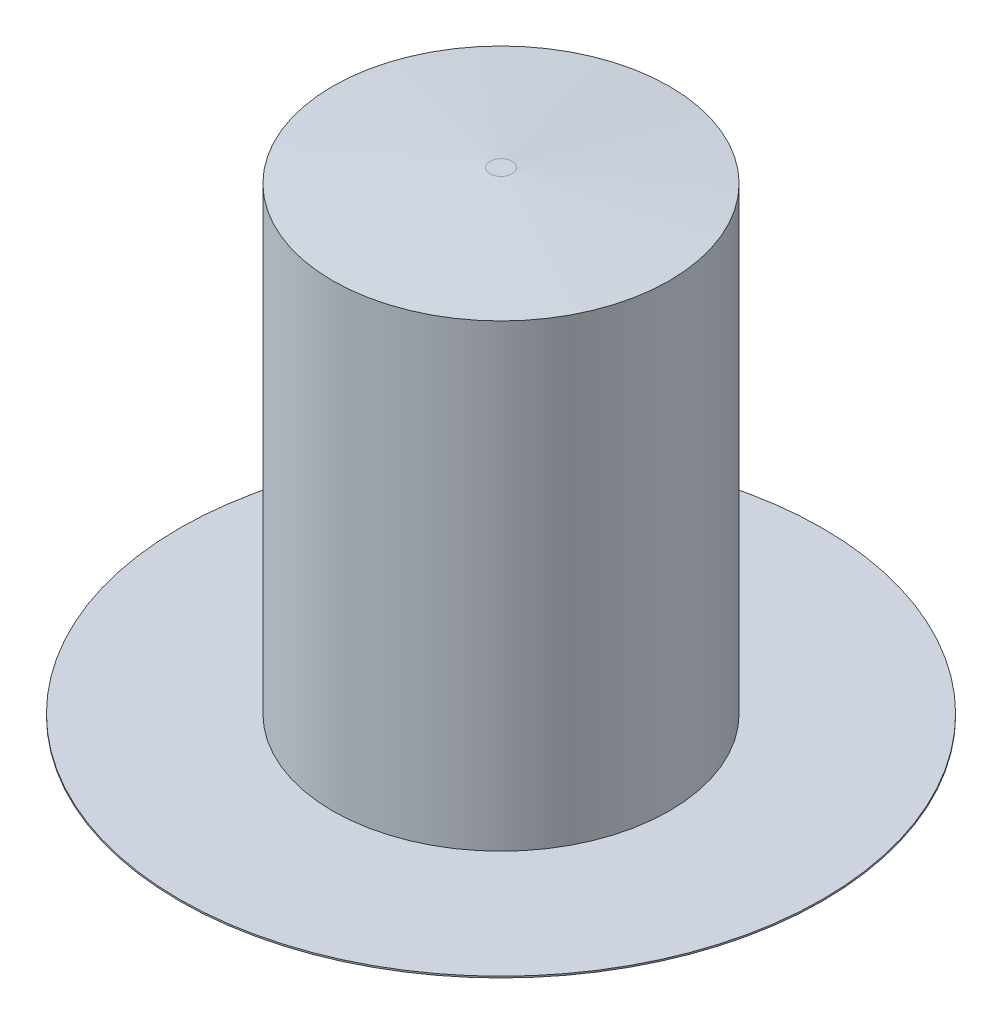
ISO-10303-21;
HEADER;
FILE_DESCRIPTION(('STEP AP214'),'2;1');
FILE_NAME('part.step','',(''),(''),'','','');
FILE_SCHEMA(('AUTOMOTIVE_DESIGN { 1 0 10303 214 1 1 1 1 }'));
ENDSEC;
DATA;
#1=APPLICATION_CONTEXT('core data for automotive mechanical design processes');
#2=APPLICATION_PROTOCOL_DEFINITION('international standard','automotive_design',2000,#1);
#3=PRODUCT_CONTEXT('',#1,'mechanical');
#4=PRODUCT('Part','Part','',(#3));
#5=PRODUCT_RELATED_PRODUCT_CATEGORY('part','',(#4));
#6=PRODUCT_DEFINITION_FORMATION('','',#4);
#7=PRODUCT_DEFINITION_CONTEXT('part definition',#1,'design');
#8=PRODUCT_DEFINITION('design','',#6,#7);
#9=PRODUCT_DEFINITION_SHAPE('','',#8);
#10=(LENGTH_UNIT() NAMED_UNIT(*) SI_UNIT(.MILLI.,.METRE.));
#11=(NAMED_UNIT(*) PLANE_ANGLE_UNIT() SI_UNIT($,.RADIAN.));
#12=(NAMED_UNIT(*) SI_UNIT($,.STERADIAN.) SOLID_ANGLE_UNIT());
#13=UNCERTAINTY_MEASURE_WITH_UNIT(LENGTH_MEASURE(1.E-05),#10,'distance_accuracy_value','');
#14=(GEOMETRIC_REPRESENTATION_CONTEXT(3) GLOBAL_UNCERTAINTY_ASSIGNED_CONTEXT((#13)) GLOBAL_UNIT_ASSIGNED_CONTEXT((#10,
#11,#12)) REPRESENTATION_CONTEXT('',''));
#15=CARTESIAN_POINT('',(0.,0.,0.));
#16=DIRECTION('',(0.,0.,1.));
#17=DIRECTION('',(1.,0.,0.));
#18=AXIS2_PLACEMENT_3D('',#15,#16,#17);
#19=CARTESIAN_POINT('',(0.,0.0254,0.));
#20=DIRECTION('',(0.,-1.,0.));
#21=DIRECTION('',(0.,0.,-1.));
#22=AXIS2_PLACEMENT_3D('',#19,#20,#21);
#23=CYLINDRICAL_SURFACE('',#22,5.334);
#24=CARTESIAN_POINT('',(0.,0.0254,0.));
#25=DIRECTION('',(0.,1.,0.));
#26=DIRECTION('',(0.,0.,1.));
#27=AXIS2_PLACEMENT_3D('',#24,#25,#26);
#28=CIRCLE('',#27,5.334);
#29=CARTESIAN_POINT('',(0.,0.0254,5.334));
#30=VERTEX_POINT('',#29);
#31=EDGE_CURVE('E47',#30,#30,#28,.T.);
#32=ORIENTED_EDGE('',*,*,#31,.F.);
#33=EDGE_LOOP('',(#32));
#34=FACE_BOUND('',#33,.T.);
#35=CARTESIAN_POINT('',(0.,0.,0.));
#36=DIRECTION('',(0.,1.,0.));
#37=DIRECTION('',(0.,0.,1.));
#38=AXIS2_PLACEMENT_3D('',#35,#36,#37);
#39=CIRCLE('',#38,5.334);
#40=CARTESIAN_POINT('',(0.,0.,5.334));
#41=VERTEX_POINT('',#40);
#42=EDGE_CURVE('E42',#41,#41,#39,.T.);
#43=ORIENTED_EDGE('',*,*,#42,.T.);
#44=EDGE_LOOP('',(#43));
#45=FACE_BOUND('',#44,.T.);
#46=ADVANCED_FACE('F39',(#34,#45),#23,.T.);
#47=CARTESIAN_POINT('',(0.,0.0254,0.));
#48=DIRECTION('',(0.,1.,0.));
#49=DIRECTION('',(0.,0.,1.));
#50=AXIS2_PLACEMENT_3D('',#47,#48,#49);
#51=PLANE('',#50);
#52=CARTESIAN_POINT('',(0.,0.0254,0.));
#53=DIRECTION('',(0.,1.,0.));
#54=DIRECTION('',(0.,0.,1.));
#55=AXIS2_PLACEMENT_3D('',#52,#53,#54);
#56=CIRCLE('',#55,2.794);
#57=CARTESIAN_POINT('',(0.,0.0254000000000001,-2.794));
#58=VERTEX_POINT('',#57);
#59=EDGE_CURVE('E10',#58,#58,#56,.T.);
#60=ORIENTED_EDGE('',*,*,#59,.F.);
#61=EDGE_LOOP('',(#60));
#62=FACE_BOUND('',#61,.T.);
#63=ORIENTED_EDGE('',*,*,#31,.T.);
#64=EDGE_LOOP('',(#63));
#65=FACE_BOUND('',#64,.T.);
#66=ADVANCED_FACE('F78',(#62,#65),#51,.T.);
#67=CARTESIAN_POINT('',(0.,0.,0.));
#68=DIRECTION('',(0.,1.,0.));
#69=DIRECTION('',(0.,0.,1.));
#70=AXIS2_PLACEMENT_3D('',#67,#68,#69);
#71=PLANE('',#70);
#72=ORIENTED_EDGE('',*,*,#42,.F.);
#73=EDGE_LOOP('',(#72));
#74=FACE_BOUND('',#73,.T.);
#75=ADVANCED_FACE('F73',(#74),#71,.F.);
#76=CARTESIAN_POINT('',(0.,7.6454,0.));
#77=DIRECTION('',(0.,-1.,0.));
#78=DIRECTION('',(0.,0.,-1.));
#79=AXIS2_PLACEMENT_3D('',#76,#77,#78);
#80=CYLINDRICAL_SURFACE('',#79,2.794);
#81=CARTESIAN_POINT('',(0.,7.6454,0.));
#82=DIRECTION('',(0.,1.,0.));
#83=DIRECTION('',(0.,0.,1.));
#84=AXIS2_PLACEMENT_3D('',#81,#82,#83);
#85=CIRCLE('',#84,2.794);
#86=CARTESIAN_POINT('',(0.,7.6454,-2.794));
#87=VERTEX_POINT('',#86);
#88=EDGE_CURVE('E54',#87,#87,#85,.T.);
#89=CARTESIAN_POINT('',(0.,7.6454,-2.794));
#90=CARTESIAN_POINT('',(0.,7.566025,-2.794));
#91=CARTESIAN_POINT('',(0.,7.48665,-2.794));
#92=CARTESIAN_POINT('',(0.,7.3279,-2.794));
#93=CARTESIAN_POINT('',(0.,7.248525,-2.794));
#94=CARTESIAN_POINT('',(0.,7.089775,-2.794));
#95=CARTESIAN_POINT('',(0.,7.0104,-2.794));
#96=CARTESIAN_POINT('',(0.,6.85165,-2.794));
#97=CARTESIAN_POINT('',(0.,6.772275,-2.794));
#98=CARTESIAN_POINT('',(0.,6.613525,-2.794));
#99=CARTESIAN_POINT('',(0.,6.53415,-2.794));
#100=CARTESIAN_POINT('',(0.,6.3754,-2.794));
#101=CARTESIAN_POINT('',(0.,6.296025,-2.794));
#102=CARTESIAN_POINT('',(0.,6.137275,-2.794));
#103=CARTESIAN_POINT('',(0.,6.0579,-2.794));
#104=CARTESIAN_POINT('',(0.,5.89915,-2.794));
#105=CARTESIAN_POINT('',(0.,5.819775,-2.794));
#106=CARTESIAN_POINT('',(0.,5.661025,-2.794));
#107=CARTESIAN_POINT('',(0.,5.58165,-2.794));
#108=CARTESIAN_POINT('',(0.,5.4229,-2.794));
#109=CARTESIAN_POINT('',(0.,5.343525,-2.794));
#110=CARTESIAN_POINT('',(0.,5.184775,-2.794));
#111=CARTESIAN_POINT('',(0.,5.1054,-2.794));
#112=CARTESIAN_POINT('',(0.,4.94665,-2.794));
#113=CARTESIAN_POINT('',(0.,4.867275,-2.794));
#114=CARTESIAN_POINT('',(0.,4.708525,-2.794));
#115=CARTESIAN_POINT('',(0.,4.62915,-2.794));
#116=CARTESIAN_POINT('',(0.,4.4704,-2.794));
#117=CARTESIAN_POINT('',(0.,4.391025,-2.794));
#118=CARTESIAN_POINT('',(0.,4.232275,-2.794));
#119=CARTESIAN_POINT('',(0.,4.1529,-2.794));
#120=CARTESIAN_POINT('',(0.,3.99415,-2.794));
#121=CARTESIAN_POINT('',(0.,3.914775,-2.794));
#122=CARTESIAN_POINT('',(0.,3.756025,-2.794));
#123=CARTESIAN_POINT('',(0.,3.67665,-2.794));
#124=CARTESIAN_POINT('',(0.,3.5179,-2.794));
#125=CARTESIAN_POINT('',(0.,3.438525,-2.794));
#126=CARTESIAN_POINT('',(0.,3.279775,-2.794));
#127=CARTESIAN_POINT('',(0.,3.2004,-2.794));
#128=CARTESIAN_POINT('',(0.,3.04165,-2.794));
#129=CARTESIAN_POINT('',(0.,2.962275,-2.794));
#130=CARTESIAN_POINT('',(0.,2.803525,-2.794));
#131=CARTESIAN_POINT('',(0.,2.72415,-2.794));
#132=CARTESIAN_POINT('',(0.,2.5654,-2.794));
#133=CARTESIAN_POINT('',(0.,2.486025,-2.794));
#134=CARTESIAN_POINT('',(0.,2.327275,-2.794));
#135=CARTESIAN_POINT('',(0.,2.2479,-2.794));
#136=CARTESIAN_POINT('',(0.,2.08915,-2.794));
#137=CARTESIAN_POINT('',(0.,2.009775,-2.794));
#138=CARTESIAN_POINT('',(0.,1.851025,-2.794));
#139=CARTESIAN_POINT('',(0.,1.77165,-2.794));
#140=CARTESIAN_POINT('',(0.,1.6129,-2.794));
#141=CARTESIAN_POINT('',(0.,1.533525,-2.794));
#142=CARTESIAN_POINT('',(0.,1.374775,-2.794));
#143=CARTESIAN_POINT('',(0.,1.2954,-2.794));
#144=CARTESIAN_POINT('',(0.,1.13665,-2.794));
#145=CARTESIAN_POINT('',(0.,1.057275,-2.794));
#146=CARTESIAN_POINT('',(0.,0.898525,-2.794));
#147=CARTESIAN_POINT('',(0.,0.81915,-2.794));
#148=CARTESIAN_POINT('',(0.,0.6604,-2.794));
#149=CARTESIAN_POINT('',(0.,0.581025,-2.794));
#150=CARTESIAN_POINT('',(0.,0.422275,-2.794));
#151=CARTESIAN_POINT('',(0.,0.3429,-2.794));
#152=CARTESIAN_POINT('',(0.,0.18415,-2.794));
#153=CARTESIAN_POINT('',(0.,0.104775,-2.794));
#154=CARTESIAN_POINT('',(0.,0.0254000000000001,-2.794));
#155=B_SPLINE_CURVE_WITH_KNOTS('',3,(#89,#90,#91,#92,#93,#94,#95,#96,#97,#98,#99,#100,#101,#102,
#103,#104,#105,#106,#107,#108,#109,#110,#111,#112,#113,#114,#115,#116,#117,#118,#119,#120,#121,
#122,#123,#124,#125,#126,#127,#128,#129,#130,#131,#132,#133,#134,#135,#136,#137,#138,#139,#140,
#141,#142,#143,#144,#145,#146,#147,#148,#149,#150,#151,#152,#153,#154),.UNSPECIFIED.,.F.,.F.,(4,
2,2,2,2,2,2,2,2,2,2,2,2,2,2,2,2,2,2,2,2,2,2,2,2,2,2,2,2,2,2,2,4),(0.,0.238125,0.47625,
0.714375000000001,0.9525,1.190625,1.42875,1.666875,1.905,2.143125,2.38125,2.619375,2.8575,
3.095625,3.33375,3.571875,3.81,4.048125,4.28625,4.524375,4.7625,5.000625,5.23875,5.476875,5.715,
5.953125,6.19125,6.429375,6.6675,6.905625,7.14375,7.381875,7.62),.UNSPECIFIED.);
#156=EDGE_CURVE('BSEAM68',#87,#58,#155,.T.);
#157=ORIENTED_EDGE('',*,*,#88,.F.);
#158=ORIENTED_EDGE('',*,*,#59,.T.);
#159=ORIENTED_EDGE('',*,*,#156,.T.);
#160=ORIENTED_EDGE('',*,*,#156,.F.);
#161=EDGE_LOOP('',(#157,#159,#158,#160));
#162=FACE_BOUND('',#161,.T.);
#163=ADVANCED_FACE('F68',(#162),#80,.T.);
#164=CARTESIAN_POINT('',(0.,7.6454,0.));
#165=DIRECTION('',(0.,-1.,0.));
#166=DIRECTION('',(0.,0.,1.));
#167=AXIS2_PLACEMENT_3D('',#164,#165,#166);
#168=CONICAL_SURFACE('',#167,2.794,1.48352986418518);
#169=CARTESIAN_POINT('',(0.,7.874,0.));
#170=DIRECTION('',(0.,1.,0.));
#171=DIRECTION('',(0.,0.,1.));
#172=AXIS2_PLACEMENT_3D('',#169,#170,#171);
#173=CIRCLE('',#172,0.181090043889602);
#174=CARTESIAN_POINT('',(0.,7.874,0.181090043889602));
#175=VERTEX_POINT('',#174);
#176=EDGE_CURVE('E58',#175,#175,#173,.T.);
#177=ORIENTED_EDGE('',*,*,#176,.F.);
#178=EDGE_LOOP('',(#177));
#179=FACE_BOUND('',#178,.T.);
#180=ORIENTED_EDGE('',*,*,#88,.T.);
#181=EDGE_LOOP('',(#180));
#182=FACE_BOUND('',#181,.T.);
#183=ADVANCED_FACE('F65',(#179,#182),#168,.T.);
#184=CARTESIAN_POINT('',(0.,7.874,0.));
#185=DIRECTION('',(0.,1.,0.));
#186=DIRECTION('',(0.,0.,1.));
#187=AXIS2_PLACEMENT_3D('',#184,#185,#186);
#188=PLANE('',#187);
#189=ORIENTED_EDGE('',*,*,#176,.T.);
#190=EDGE_LOOP('',(#189));
#191=FACE_BOUND('',#190,.T.);
#192=ADVANCED_FACE('F63',(#191),#188,.T.);
#193=CLOSED_SHELL('',(#46,#66,#75,#163,#183,#192));
#194=MANIFOLD_SOLID_BREP('B2',#193);
#195=ADVANCED_BREP_SHAPE_REPRESENTATION('',(#18,#194),#14);
#196=SHAPE_DEFINITION_REPRESENTATION(#9,#195);
ENDSEC;
END-ISO-10303-21;
